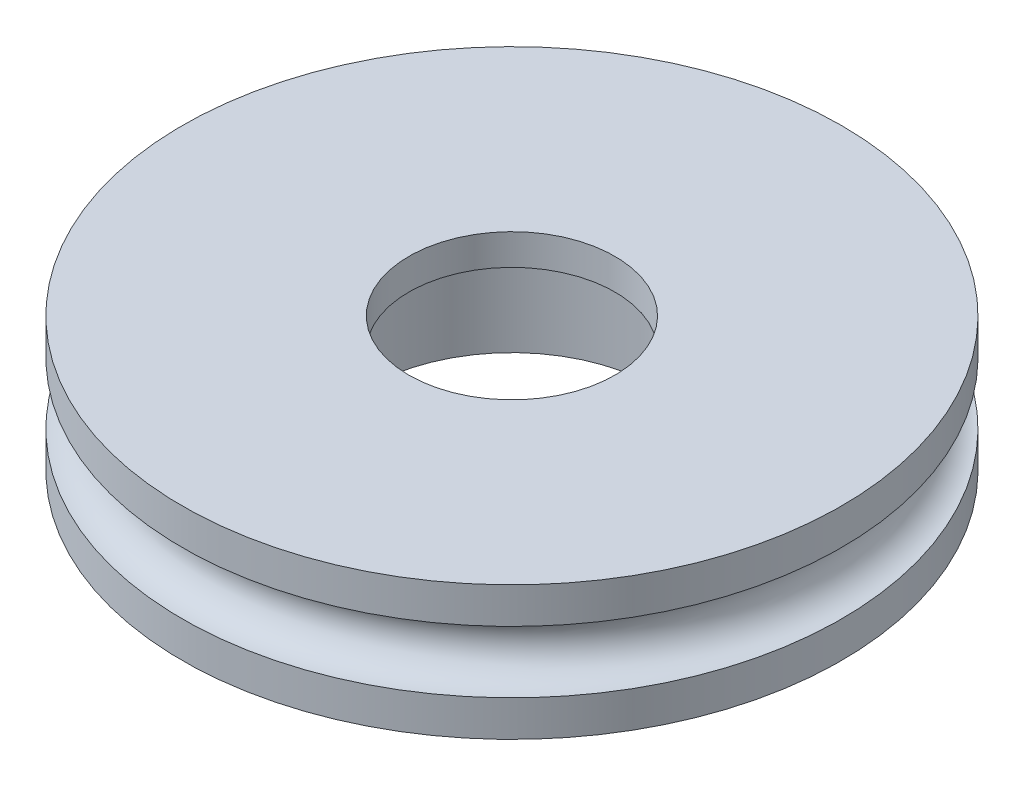
ISO-10303-21;
HEADER;
FILE_DESCRIPTION(('STEP AP214'),'2;1');
FILE_NAME('part.step','',(''),(''),'','','');
FILE_SCHEMA(('AUTOMOTIVE_DESIGN { 1 0 10303 214 1 1 1 1 }'));
ENDSEC;
DATA;
#1=APPLICATION_CONTEXT('core data for automotive mechanical design processes');
#2=APPLICATION_PROTOCOL_DEFINITION('international standard','automotive_design',2000,#1);
#3=PRODUCT_CONTEXT('',#1,'mechanical');
#4=PRODUCT('Part','Part','',(#3));
#5=PRODUCT_RELATED_PRODUCT_CATEGORY('part','',(#4));
#6=PRODUCT_DEFINITION_FORMATION('','',#4);
#7=PRODUCT_DEFINITION_CONTEXT('part definition',#1,'design');
#8=PRODUCT_DEFINITION('design','',#6,#7);
#9=PRODUCT_DEFINITION_SHAPE('','',#8);
#10=(LENGTH_UNIT() NAMED_UNIT(*) SI_UNIT(.MILLI.,.METRE.));
#11=(NAMED_UNIT(*) PLANE_ANGLE_UNIT() SI_UNIT($,.RADIAN.));
#12=(NAMED_UNIT(*) SI_UNIT($,.STERADIAN.) SOLID_ANGLE_UNIT());
#13=UNCERTAINTY_MEASURE_WITH_UNIT(LENGTH_MEASURE(1.E-05),#10,'distance_accuracy_value','');
#14=(GEOMETRIC_REPRESENTATION_CONTEXT(3) GLOBAL_UNCERTAINTY_ASSIGNED_CONTEXT((#13)) GLOBAL_UNIT_ASSIGNED_CONTEXT((#10,
#11,#12)) REPRESENTATION_CONTEXT('',''));
#15=CARTESIAN_POINT('',(0.,0.,0.));
#16=DIRECTION('',(0.,0.,1.));
#17=DIRECTION('',(1.,0.,0.));
#18=AXIS2_PLACEMENT_3D('',#15,#16,#17);
#19=CARTESIAN_POINT('',(0.,1.625,0.));
#20=DIRECTION('',(0.,-1.,0.));
#21=DIRECTION('',(0.,0.,-1.));
#22=AXIS2_PLACEMENT_3D('',#19,#20,#21);
#23=CYLINDRICAL_SURFACE('',#22,3.5);
#24=CARTESIAN_POINT('',(0.,-1.625,0.));
#25=DIRECTION('',(0.,1.,0.));
#26=DIRECTION('',(0.,0.,1.));
#27=AXIS2_PLACEMENT_3D('',#24,#25,#26);
#28=CIRCLE('',#27,3.5);
#29=CARTESIAN_POINT('',(0.,-1.625,-3.5));
#30=VERTEX_POINT('',#29);
#31=EDGE_CURVE('E58',#30,#30,#28,.T.);
#32=CARTESIAN_POINT('',(0.,0.875,0.));
#33=DIRECTION('',(0.,1.,0.));
#34=DIRECTION('',(0.,0.,1.));
#35=AXIS2_PLACEMENT_3D('',#32,#33,#34);
#36=CIRCLE('',#35,3.5);
#37=CARTESIAN_POINT('',(0.,0.875,-3.5));
#38=VERTEX_POINT('',#37);
#39=EDGE_CURVE('E68',#38,#38,#36,.T.);
#40=CARTESIAN_POINT('',(0.,-1.625,-3.5));
#41=CARTESIAN_POINT('',(0.,-1.59895833333333,-3.5));
#42=CARTESIAN_POINT('',(0.,-1.57291666666667,-3.5));
#43=CARTESIAN_POINT('',(0.,-1.52083333333333,-3.5));
#44=CARTESIAN_POINT('',(0.,-1.49479166666667,-3.5));
#45=CARTESIAN_POINT('',(0.,-1.44270833333333,-3.5));
#46=CARTESIAN_POINT('',(0.,-1.41666666666667,-3.5));
#47=CARTESIAN_POINT('',(0.,-1.36458333333333,-3.5));
#48=CARTESIAN_POINT('',(0.,-1.33854166666667,-3.5));
#49=CARTESIAN_POINT('',(0.,-1.28645833333333,-3.5));
#50=CARTESIAN_POINT('',(0.,-1.26041666666667,-3.5));
#51=CARTESIAN_POINT('',(0.,-1.20833333333333,-3.5));
#52=CARTESIAN_POINT('',(0.,-1.18229166666667,-3.5));
#53=CARTESIAN_POINT('',(0.,-1.13020833333333,-3.5));
#54=CARTESIAN_POINT('',(0.,-1.10416666666667,-3.5));
#55=CARTESIAN_POINT('',(0.,-1.05208333333333,-3.5));
#56=CARTESIAN_POINT('',(0.,-1.02604166666667,-3.5));
#57=CARTESIAN_POINT('',(0.,-0.973958333333333,-3.5));
#58=CARTESIAN_POINT('',(0.,-0.947916666666667,-3.5));
#59=CARTESIAN_POINT('',(0.,-0.895833333333333,-3.5));
#60=CARTESIAN_POINT('',(0.,-0.869791666666667,-3.5));
#61=CARTESIAN_POINT('',(0.,-0.817708333333333,-3.5));
#62=CARTESIAN_POINT('',(0.,-0.791666666666667,-3.5));
#63=CARTESIAN_POINT('',(0.,-0.739583333333333,-3.5));
#64=CARTESIAN_POINT('',(0.,-0.713541666666667,-3.5));
#65=CARTESIAN_POINT('',(0.,-0.661458333333333,-3.5));
#66=CARTESIAN_POINT('',(0.,-0.635416666666667,-3.5));
#67=CARTESIAN_POINT('',(0.,-0.583333333333333,-3.5));
#68=CARTESIAN_POINT('',(0.,-0.557291666666667,-3.5));
#69=CARTESIAN_POINT('',(0.,-0.505208333333333,-3.5));
#70=CARTESIAN_POINT('',(0.,-0.479166666666666,-3.5));
#71=CARTESIAN_POINT('',(0.,-0.427083333333333,-3.5));
#72=CARTESIAN_POINT('',(0.,-0.401041666666666,-3.5));
#73=CARTESIAN_POINT('',(0.,-0.348958333333333,-3.5));
#74=CARTESIAN_POINT('',(0.,-0.322916666666667,-3.5));
#75=CARTESIAN_POINT('',(0.,-0.270833333333333,-3.5));
#76=CARTESIAN_POINT('',(0.,-0.244791666666667,-3.5));
#77=CARTESIAN_POINT('',(0.,-0.192708333333334,-3.5));
#78=CARTESIAN_POINT('',(0.,-0.166666666666667,-3.5));
#79=CARTESIAN_POINT('',(0.,-0.114583333333333,-3.5));
#80=CARTESIAN_POINT('',(0.,-0.0885416666666668,-3.5));
#81=CARTESIAN_POINT('',(0.,-0.0364583333333334,-3.5));
#82=CARTESIAN_POINT('',(0.,-0.0104166666666668,-3.5));
#83=CARTESIAN_POINT('',(0.,0.0416666666666665,-3.5));
#84=CARTESIAN_POINT('',(0.,0.0677083333333332,-3.5));
#85=CARTESIAN_POINT('',(0.,0.119791666666667,-3.5));
#86=CARTESIAN_POINT('',(0.,0.145833333333333,-3.5));
#87=CARTESIAN_POINT('',(0.,0.197916666666667,-3.5));
#88=CARTESIAN_POINT('',(0.,0.223958333333333,-3.5));
#89=CARTESIAN_POINT('',(0.,0.276041666666666,-3.5));
#90=CARTESIAN_POINT('',(0.,0.302083333333333,-3.5));
#91=CARTESIAN_POINT('',(0.,0.354166666666667,-3.5));
#92=CARTESIAN_POINT('',(0.,0.380208333333333,-3.5));
#93=CARTESIAN_POINT('',(0.,0.432291666666667,-3.5));
#94=CARTESIAN_POINT('',(0.,0.458333333333333,-3.5));
#95=CARTESIAN_POINT('',(0.,0.510416666666667,-3.5));
#96=CARTESIAN_POINT('',(0.,0.536458333333333,-3.5));
#97=CARTESIAN_POINT('',(0.,0.588541666666667,-3.5));
#98=CARTESIAN_POINT('',(0.,0.614583333333333,-3.5));
#99=CARTESIAN_POINT('',(0.,0.666666666666666,-3.5));
#100=CARTESIAN_POINT('',(0.,0.692708333333333,-3.5));
#101=CARTESIAN_POINT('',(0.,0.744791666666666,-3.5));
#102=CARTESIAN_POINT('',(0.,0.770833333333333,-3.5));
#103=CARTESIAN_POINT('',(0.,0.822916666666666,-3.5));
#104=CARTESIAN_POINT('',(0.,0.848958333333333,-3.5));
#105=CARTESIAN_POINT('',(0.,0.875,-3.5));
#106=B_SPLINE_CURVE_WITH_KNOTS('',3,(#40,#41,#42,#43,#44,#45,#46,#47,#48,#49,#50,#51,#52,#53,
#54,#55,#56,#57,#58,#59,#60,#61,#62,#63,#64,#65,#66,#67,#68,#69,#70,#71,#72,#73,#74,#75,#76,#77,
#78,#79,#80,#81,#82,#83,#84,#85,#86,#87,#88,#89,#90,#91,#92,#93,#94,#95,#96,#97,#98,#99,#100,
#101,#102,#103,#104,#105),.UNSPECIFIED.,.F.,.F.,(4,2,2,2,2,2,2,2,2,2,2,2,2,2,2,2,2,2,2,2,2,2,2,
2,2,2,2,2,2,2,2,2,4),(0.,0.0781250000000001,0.15625,0.234375,0.3125,0.390625,0.46875,0.546875,
0.625,0.703125,0.78125,0.859375,0.9375,1.015625,1.09375,1.171875,1.25,1.328125,1.40625,1.484375,
1.5625,1.640625,1.71875,1.796875,1.875,1.953125,2.03125,2.109375,2.1875,2.265625,2.34375,
2.421875,2.5),.UNSPECIFIED.);
#107=EDGE_CURVE('BSEAM47',#30,#38,#106,.T.);
#108=ORIENTED_EDGE('',*,*,#31,.F.);
#109=ORIENTED_EDGE('',*,*,#39,.T.);
#110=ORIENTED_EDGE('',*,*,#107,.T.);
#111=ORIENTED_EDGE('',*,*,#107,.F.);
#112=EDGE_LOOP('',(#108,#110,#109,#111));
#113=FACE_BOUND('',#112,.T.);
#114=ADVANCED_FACE('F47',(#113),#23,.F.);
#115=CARTESIAN_POINT('',(0.,1.625,0.));
#116=DIRECTION('',(0.,-1.,0.));
#117=DIRECTION('',(0.,0.,-1.));
#118=AXIS2_PLACEMENT_3D('',#115,#116,#117);
#119=CYLINDRICAL_SURFACE('',#118,8.);
#120=CARTESIAN_POINT('',(0.,0.75,0.));
#121=DIRECTION('',(0.,1.,0.));
#122=DIRECTION('',(0.,0.,1.));
#123=AXIS2_PLACEMENT_3D('',#120,#121,#122);
#124=CIRCLE('',#123,8.);
#125=CARTESIAN_POINT('',(0.,0.75,-8.));
#126=VERTEX_POINT('',#125);
#127=EDGE_CURVE('E65',#126,#126,#124,.T.);
#128=CARTESIAN_POINT('',(0.,1.625,0.));
#129=DIRECTION('',(0.,1.,0.));
#130=DIRECTION('',(0.,0.,1.));
#131=AXIS2_PLACEMENT_3D('',#128,#129,#130);
#132=CIRCLE('',#131,8.);
#133=CARTESIAN_POINT('',(0.,1.625,-8.));
#134=VERTEX_POINT('',#133);
#135=EDGE_CURVE('E12',#134,#134,#132,.T.);
#136=CARTESIAN_POINT('',(0.,0.75,-8.));
#137=CARTESIAN_POINT('',(0.,0.759114583333333,-8.));
#138=CARTESIAN_POINT('',(0.,0.768229166666667,-8.));
#139=CARTESIAN_POINT('',(0.,0.786458333333333,-8.));
#140=CARTESIAN_POINT('',(0.,0.795572916666667,-8.));
#141=CARTESIAN_POINT('',(0.,0.813802083333333,-8.));
#142=CARTESIAN_POINT('',(0.,0.822916666666667,-8.));
#143=CARTESIAN_POINT('',(0.,0.841145833333333,-8.));
#144=CARTESIAN_POINT('',(0.,0.850260416666667,-8.));
#145=CARTESIAN_POINT('',(0.,0.868489583333333,-8.));
#146=CARTESIAN_POINT('',(0.,0.877604166666667,-8.));
#147=CARTESIAN_POINT('',(0.,0.895833333333333,-8.));
#148=CARTESIAN_POINT('',(0.,0.904947916666667,-8.));
#149=CARTESIAN_POINT('',(0.,0.923177083333333,-8.));
#150=CARTESIAN_POINT('',(0.,0.932291666666667,-8.));
#151=CARTESIAN_POINT('',(0.,0.950520833333333,-8.));
#152=CARTESIAN_POINT('',(0.,0.959635416666667,-8.));
#153=CARTESIAN_POINT('',(0.,0.977864583333333,-8.));
#154=CARTESIAN_POINT('',(0.,0.986979166666667,-8.));
#155=CARTESIAN_POINT('',(0.,1.00520833333333,-8.));
#156=CARTESIAN_POINT('',(0.,1.01432291666667,-8.));
#157=CARTESIAN_POINT('',(0.,1.03255208333333,-8.));
#158=CARTESIAN_POINT('',(0.,1.04166666666667,-8.));
#159=CARTESIAN_POINT('',(0.,1.05989583333333,-8.));
#160=CARTESIAN_POINT('',(0.,1.06901041666667,-8.));
#161=CARTESIAN_POINT('',(0.,1.08723958333333,-8.));
#162=CARTESIAN_POINT('',(0.,1.09635416666667,-8.));
#163=CARTESIAN_POINT('',(0.,1.11458333333333,-8.));
#164=CARTESIAN_POINT('',(0.,1.12369791666667,-8.));
#165=CARTESIAN_POINT('',(0.,1.14192708333333,-8.));
#166=CARTESIAN_POINT('',(0.,1.15104166666667,-8.));
#167=CARTESIAN_POINT('',(0.,1.16927083333333,-8.));
#168=CARTESIAN_POINT('',(0.,1.17838541666667,-8.));
#169=CARTESIAN_POINT('',(0.,1.19661458333333,-8.));
#170=CARTESIAN_POINT('',(0.,1.20572916666667,-8.));
#171=CARTESIAN_POINT('',(0.,1.22395833333333,-8.));
#172=CARTESIAN_POINT('',(0.,1.23307291666667,-8.));
#173=CARTESIAN_POINT('',(0.,1.25130208333333,-8.));
#174=CARTESIAN_POINT('',(0.,1.26041666666667,-8.));
#175=CARTESIAN_POINT('',(0.,1.27864583333333,-8.));
#176=CARTESIAN_POINT('',(0.,1.28776041666667,-8.));
#177=CARTESIAN_POINT('',(0.,1.30598958333333,-8.));
#178=CARTESIAN_POINT('',(0.,1.31510416666667,-8.));
#179=CARTESIAN_POINT('',(0.,1.33333333333333,-8.));
#180=CARTESIAN_POINT('',(0.,1.34244791666667,-8.));
#181=CARTESIAN_POINT('',(0.,1.36067708333333,-8.));
#182=CARTESIAN_POINT('',(0.,1.36979166666667,-8.));
#183=CARTESIAN_POINT('',(0.,1.38802083333333,-8.));
#184=CARTESIAN_POINT('',(0.,1.39713541666667,-8.));
#185=CARTESIAN_POINT('',(0.,1.41536458333333,-8.));
#186=CARTESIAN_POINT('',(0.,1.42447916666667,-8.));
#187=CARTESIAN_POINT('',(0.,1.44270833333333,-8.));
#188=CARTESIAN_POINT('',(0.,1.45182291666667,-8.));
#189=CARTESIAN_POINT('',(0.,1.47005208333333,-8.));
#190=CARTESIAN_POINT('',(0.,1.47916666666667,-8.));
#191=CARTESIAN_POINT('',(0.,1.49739583333333,-8.));
#192=CARTESIAN_POINT('',(0.,1.50651041666667,-8.));
#193=CARTESIAN_POINT('',(0.,1.52473958333333,-8.));
#194=CARTESIAN_POINT('',(0.,1.53385416666667,-8.));
#195=CARTESIAN_POINT('',(0.,1.55208333333333,-8.));
#196=CARTESIAN_POINT('',(0.,1.56119791666667,-8.));
#197=CARTESIAN_POINT('',(0.,1.57942708333333,-8.));
#198=CARTESIAN_POINT('',(0.,1.58854166666667,-8.));
#199=CARTESIAN_POINT('',(0.,1.60677083333333,-8.));
#200=CARTESIAN_POINT('',(0.,1.61588541666667,-8.));
#201=CARTESIAN_POINT('',(0.,1.625,-8.));
#202=B_SPLINE_CURVE_WITH_KNOTS('',3,(#136,#137,#138,#139,#140,#141,#142,#143,#144,#145,#146,
#147,#148,#149,#150,#151,#152,#153,#154,#155,#156,#157,#158,#159,#160,#161,#162,#163,#164,#165,
#166,#167,#168,#169,#170,#171,#172,#173,#174,#175,#176,#177,#178,#179,#180,#181,#182,#183,#184,
#185,#186,#187,#188,#189,#190,#191,#192,#193,#194,#195,#196,#197,#198,#199,#200,#201),
.UNSPECIFIED.,.F.,.F.,(4,2,2,2,2,2,2,2,2,2,2,2,2,2,2,2,2,2,2,2,2,2,2,2,2,2,2,2,2,2,2,2,4),(0.,
0.02734375,0.0546874999999999,0.08203125,0.109375,0.13671875,0.1640625,0.19140625,0.21875,
0.24609375,0.2734375,0.30078125,0.328125,0.35546875,0.3828125,0.41015625,0.4375,0.46484375,
0.4921875,0.51953125,0.546875,0.57421875,0.6015625,0.62890625,0.65625,0.68359375,0.7109375,
0.73828125,0.765625,0.79296875,0.8203125,0.84765625,0.875),.UNSPECIFIED.);
#203=EDGE_CURVE('BSEAM90',#126,#134,#202,.T.);
#204=ORIENTED_EDGE('',*,*,#127,.T.);
#205=ORIENTED_EDGE('',*,*,#135,.F.);
#206=ORIENTED_EDGE('',*,*,#203,.T.);
#207=ORIENTED_EDGE('',*,*,#203,.F.);
#208=EDGE_LOOP('',(#204,#206,#205,#207));
#209=FACE_BOUND('',#208,.T.);
#210=ADVANCED_FACE('F90',(#209),#119,.T.);
#211=CARTESIAN_POINT('',(0.,1.625,0.));
#212=DIRECTION('',(0.,1.,0.));
#213=DIRECTION('',(0.,0.,1.));
#214=AXIS2_PLACEMENT_3D('',#211,#212,#213);
#215=PLANE('',#214);
#216=ORIENTED_EDGE('',*,*,#135,.T.);
#217=EDGE_LOOP('',(#216));
#218=FACE_BOUND('',#217,.T.);
#219=CARTESIAN_POINT('',(0.,1.625,0.));
#220=DIRECTION('',(0.,1.,0.));
#221=DIRECTION('',(0.,0.,1.));
#222=AXIS2_PLACEMENT_3D('',#219,#220,#221);
#223=CIRCLE('',#222,2.5);
#224=CARTESIAN_POINT('',(0.,1.625,2.5));
#225=VERTEX_POINT('',#224);
#226=EDGE_CURVE('E72',#225,#225,#223,.T.);
#227=ORIENTED_EDGE('',*,*,#226,.F.);
#228=EDGE_LOOP('',(#227));
#229=FACE_BOUND('',#228,.T.);
#230=ADVANCED_FACE('F87',(#218,#229),#215,.T.);
#231=CARTESIAN_POINT('',(0.,-1.625,0.));
#232=DIRECTION('',(0.,1.,0.));
#233=DIRECTION('',(0.,0.,1.));
#234=AXIS2_PLACEMENT_3D('',#231,#232,#233);
#235=PLANE('',#234);
#236=CARTESIAN_POINT('',(0.,-1.625,0.));
#237=DIRECTION('',(0.,1.,0.));
#238=DIRECTION('',(0.,0.,1.));
#239=AXIS2_PLACEMENT_3D('',#236,#237,#238);
#240=CIRCLE('',#239,8.);
#241=CARTESIAN_POINT('',(0.,-1.625,-8.));
#242=VERTEX_POINT('',#241);
#243=EDGE_CURVE('E51',#242,#242,#240,.T.);
#244=ORIENTED_EDGE('',*,*,#243,.F.);
#245=EDGE_LOOP('',(#244));
#246=FACE_BOUND('',#245,.T.);
#247=ORIENTED_EDGE('',*,*,#31,.T.);
#248=EDGE_LOOP('',(#247));
#249=FACE_BOUND('',#248,.T.);
#250=ADVANCED_FACE('F89',(#246,#249),#235,.F.);
#251=CARTESIAN_POINT('',(0.,-0.75,0.));
#252=DIRECTION('',(0.,1.,0.));
#253=DIRECTION('',(0.,0.,1.));
#254=AXIS2_PLACEMENT_3D('',#251,#252,#253);
#255=CIRCLE('',#254,8.);
#256=CARTESIAN_POINT('',(0.,-0.75,-8.));
#257=VERTEX_POINT('',#256);
#258=EDGE_CURVE('E62',#257,#257,#255,.T.);
#259=CARTESIAN_POINT('',(0.,-0.75,-8.));
#260=CARTESIAN_POINT('',(0.,-0.759114583333333,-8.));
#261=CARTESIAN_POINT('',(0.,-0.768229166666667,-8.));
#262=CARTESIAN_POINT('',(0.,-0.786458333333333,-8.));
#263=CARTESIAN_POINT('',(0.,-0.795572916666667,-8.));
#264=CARTESIAN_POINT('',(0.,-0.813802083333333,-8.));
#265=CARTESIAN_POINT('',(0.,-0.822916666666667,-8.));
#266=CARTESIAN_POINT('',(0.,-0.841145833333333,-8.));
#267=CARTESIAN_POINT('',(0.,-0.850260416666667,-8.));
#268=CARTESIAN_POINT('',(0.,-0.868489583333333,-8.));
#269=CARTESIAN_POINT('',(0.,-0.877604166666667,-8.));
#270=CARTESIAN_POINT('',(0.,-0.895833333333333,-8.));
#271=CARTESIAN_POINT('',(0.,-0.904947916666667,-8.));
#272=CARTESIAN_POINT('',(0.,-0.923177083333333,-8.));
#273=CARTESIAN_POINT('',(0.,-0.932291666666667,-8.));
#274=CARTESIAN_POINT('',(0.,-0.950520833333333,-8.));
#275=CARTESIAN_POINT('',(0.,-0.959635416666667,-8.));
#276=CARTESIAN_POINT('',(0.,-0.977864583333333,-8.));
#277=CARTESIAN_POINT('',(0.,-0.986979166666667,-8.));
#278=CARTESIAN_POINT('',(0.,-1.00520833333333,-8.));
#279=CARTESIAN_POINT('',(0.,-1.01432291666667,-8.));
#280=CARTESIAN_POINT('',(0.,-1.03255208333333,-8.));
#281=CARTESIAN_POINT('',(0.,-1.04166666666667,-8.));
#282=CARTESIAN_POINT('',(0.,-1.05989583333333,-8.));
#283=CARTESIAN_POINT('',(0.,-1.06901041666667,-8.));
#284=CARTESIAN_POINT('',(0.,-1.08723958333333,-8.));
#285=CARTESIAN_POINT('',(0.,-1.09635416666667,-8.));
#286=CARTESIAN_POINT('',(0.,-1.11458333333333,-8.));
#287=CARTESIAN_POINT('',(0.,-1.12369791666667,-8.));
#288=CARTESIAN_POINT('',(0.,-1.14192708333333,-8.));
#289=CARTESIAN_POINT('',(0.,-1.15104166666667,-8.));
#290=CARTESIAN_POINT('',(0.,-1.16927083333333,-8.));
#291=CARTESIAN_POINT('',(0.,-1.17838541666667,-8.));
#292=CARTESIAN_POINT('',(0.,-1.19661458333333,-8.));
#293=CARTESIAN_POINT('',(0.,-1.20572916666667,-8.));
#294=CARTESIAN_POINT('',(0.,-1.22395833333333,-8.));
#295=CARTESIAN_POINT('',(0.,-1.23307291666667,-8.));
#296=CARTESIAN_POINT('',(0.,-1.25130208333333,-8.));
#297=CARTESIAN_POINT('',(0.,-1.26041666666667,-8.));
#298=CARTESIAN_POINT('',(0.,-1.27864583333333,-8.));
#299=CARTESIAN_POINT('',(0.,-1.28776041666667,-8.));
#300=CARTESIAN_POINT('',(0.,-1.30598958333333,-8.));
#301=CARTESIAN_POINT('',(0.,-1.31510416666667,-8.));
#302=CARTESIAN_POINT('',(0.,-1.33333333333333,-8.));
#303=CARTESIAN_POINT('',(0.,-1.34244791666667,-8.));
#304=CARTESIAN_POINT('',(0.,-1.36067708333333,-8.));
#305=CARTESIAN_POINT('',(0.,-1.36979166666667,-8.));
#306=CARTESIAN_POINT('',(0.,-1.38802083333333,-8.));
#307=CARTESIAN_POINT('',(0.,-1.39713541666667,-8.));
#308=CARTESIAN_POINT('',(0.,-1.41536458333333,-8.));
#309=CARTESIAN_POINT('',(0.,-1.42447916666667,-8.));
#310=CARTESIAN_POINT('',(0.,-1.44270833333333,-8.));
#311=CARTESIAN_POINT('',(0.,-1.45182291666667,-8.));
#312=CARTESIAN_POINT('',(0.,-1.47005208333333,-8.));
#313=CARTESIAN_POINT('',(0.,-1.47916666666667,-8.));
#314=CARTESIAN_POINT('',(0.,-1.49739583333333,-8.));
#315=CARTESIAN_POINT('',(0.,-1.50651041666667,-8.));
#316=CARTESIAN_POINT('',(0.,-1.52473958333333,-8.));
#317=CARTESIAN_POINT('',(0.,-1.53385416666667,-8.));
#318=CARTESIAN_POINT('',(0.,-1.55208333333333,-8.));
#319=CARTESIAN_POINT('',(0.,-1.56119791666667,-8.));
#320=CARTESIAN_POINT('',(0.,-1.57942708333333,-8.));
#321=CARTESIAN_POINT('',(0.,-1.58854166666667,-8.));
#322=CARTESIAN_POINT('',(0.,-1.60677083333333,-8.));
#323=CARTESIAN_POINT('',(0.,-1.61588541666667,-8.));
#324=CARTESIAN_POINT('',(0.,-1.625,-8.));
#325=B_SPLINE_CURVE_WITH_KNOTS('',3,(#259,#260,#261,#262,#263,#264,#265,#266,#267,#268,#269,
#270,#271,#272,#273,#274,#275,#276,#277,#278,#279,#280,#281,#282,#283,#284,#285,#286,#287,#288,
#289,#290,#291,#292,#293,#294,#295,#296,#297,#298,#299,#300,#301,#302,#303,#304,#305,#306,#307,
#308,#309,#310,#311,#312,#313,#314,#315,#316,#317,#318,#319,#320,#321,#322,#323,#324),
.UNSPECIFIED.,.F.,.F.,(4,2,2,2,2,2,2,2,2,2,2,2,2,2,2,2,2,2,2,2,2,2,2,2,2,2,2,2,2,2,2,2,4),(0.,
0.02734375,0.0546875,0.0820312500000001,0.109375,0.13671875,0.1640625,0.19140625,0.21875,
0.24609375,0.2734375,0.30078125,0.328125,0.35546875,0.3828125,0.41015625,0.4375,0.46484375,
0.4921875,0.51953125,0.546875,0.57421875,0.6015625,0.62890625,0.65625,0.68359375,0.7109375,
0.73828125,0.765625,0.79296875,0.8203125,0.84765625,0.875),.UNSPECIFIED.);
#326=EDGE_CURVE('BSEAM49',#257,#242,#325,.T.);
#327=ORIENTED_EDGE('',*,*,#258,.F.);
#328=ORIENTED_EDGE('',*,*,#243,.T.);
#329=ORIENTED_EDGE('',*,*,#326,.T.);
#330=ORIENTED_EDGE('',*,*,#326,.F.);
#331=EDGE_LOOP('',(#327,#329,#328,#330));
#332=FACE_BOUND('',#331,.T.);
#333=ADVANCED_FACE('F49',(#332),#119,.T.);
#334=CARTESIAN_POINT('',(0.,0.,0.));
#335=DIRECTION('',(0.,1.,0.));
#336=DIRECTION('',(0.,0.,1.));
#337=AXIS2_PLACEMENT_3D('',#334,#335,#336);
#338=TOROIDAL_SURFACE('',#337,8.,0.75);
#339=ORIENTED_EDGE('',*,*,#127,.F.);
#340=EDGE_LOOP('',(#339));
#341=FACE_BOUND('',#340,.T.);
#342=ORIENTED_EDGE('',*,*,#258,.T.);
#343=EDGE_LOOP('',(#342));
#344=FACE_BOUND('',#343,.T.);
#345=ADVANCED_FACE('F106',(#341,#344),#338,.F.);
#346=CARTESIAN_POINT('',(0.,0.875,0.));
#347=DIRECTION('',(0.,1.,0.));
#348=DIRECTION('',(0.,0.,1.));
#349=AXIS2_PLACEMENT_3D('',#346,#347,#348);
#350=PLANE('',#349);
#351=CARTESIAN_POINT('',(0.,0.875,0.));
#352=DIRECTION('',(0.,1.,0.));
#353=DIRECTION('',(0.,0.,1.));
#354=AXIS2_PLACEMENT_3D('',#351,#352,#353);
#355=CIRCLE('',#354,2.5);
#356=CARTESIAN_POINT('',(0.,0.875,2.5));
#357=VERTEX_POINT('',#356);
#358=EDGE_CURVE('E71',#357,#357,#355,.T.);
#359=ORIENTED_EDGE('',*,*,#358,.T.);
#360=EDGE_LOOP('',(#359));
#361=FACE_BOUND('',#360,.T.);
#362=ORIENTED_EDGE('',*,*,#39,.F.);
#363=EDGE_LOOP('',(#362));
#364=FACE_BOUND('',#363,.T.);
#365=ADVANCED_FACE('F78',(#361,#364),#350,.F.);
#366=CARTESIAN_POINT('',(0.,0.875,0.));
#367=DIRECTION('',(0.,1.,0.));
#368=DIRECTION('',(0.,0.,1.));
#369=AXIS2_PLACEMENT_3D('',#366,#367,#368);
#370=CYLINDRICAL_SURFACE('',#369,2.5);
#371=ORIENTED_EDGE('',*,*,#358,.F.);
#372=EDGE_LOOP('',(#371));
#373=FACE_BOUND('',#372,.T.);
#374=ORIENTED_EDGE('',*,*,#226,.T.);
#375=EDGE_LOOP('',(#374));
#376=FACE_BOUND('',#375,.T.);
#377=ADVANCED_FACE('F81',(#373,#376),#370,.F.);
#378=CLOSED_SHELL('',(#114,#210,#230,#250,#333,#345,#365,#377));
#379=MANIFOLD_SOLID_BREP('B2',#378);
#380=ADVANCED_BREP_SHAPE_REPRESENTATION('',(#18,#379),#14);
#381=SHAPE_DEFINITION_REPRESENTATION(#9,#380);
ENDSEC;
END-ISO-10303-21;
